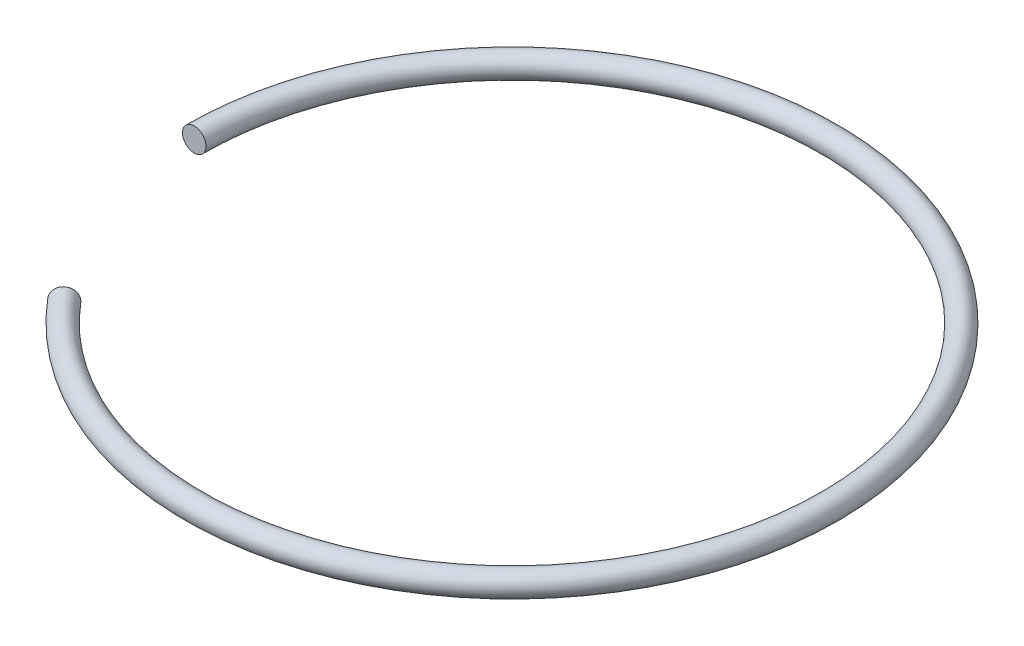
ISO-10303-21;
HEADER;
FILE_DESCRIPTION(('STEP AP214'),'2;1');
FILE_NAME('part.step','',(''),(''),'','','');
FILE_SCHEMA(('AUTOMOTIVE_DESIGN { 1 0 10303 214 1 1 1 1 }'));
ENDSEC;
DATA;
#1=APPLICATION_CONTEXT('core data for automotive mechanical design processes');
#2=APPLICATION_PROTOCOL_DEFINITION('international standard','automotive_design',2000,#1);
#3=PRODUCT_CONTEXT('',#1,'mechanical');
#4=PRODUCT('Part','Part','',(#3));
#5=PRODUCT_RELATED_PRODUCT_CATEGORY('part','',(#4));
#6=PRODUCT_DEFINITION_FORMATION('','',#4);
#7=PRODUCT_DEFINITION_CONTEXT('part definition',#1,'design');
#8=PRODUCT_DEFINITION('design','',#6,#7);
#9=PRODUCT_DEFINITION_SHAPE('','',#8);
#10=(LENGTH_UNIT() NAMED_UNIT(*) SI_UNIT(.MILLI.,.METRE.));
#11=(NAMED_UNIT(*) PLANE_ANGLE_UNIT() SI_UNIT($,.RADIAN.));
#12=(NAMED_UNIT(*) SI_UNIT($,.STERADIAN.) SOLID_ANGLE_UNIT());
#13=UNCERTAINTY_MEASURE_WITH_UNIT(LENGTH_MEASURE(1.E-05),#10,'distance_accuracy_value','');
#14=(GEOMETRIC_REPRESENTATION_CONTEXT(3) GLOBAL_UNCERTAINTY_ASSIGNED_CONTEXT((#13)) GLOBAL_UNIT_ASSIGNED_CONTEXT((#10,
#11,#12)) REPRESENTATION_CONTEXT('',''));
#15=CARTESIAN_POINT('',(0.,0.,0.));
#16=DIRECTION('',(0.,0.,1.));
#17=DIRECTION('',(1.,0.,0.));
#18=AXIS2_PLACEMENT_3D('',#15,#16,#17);
#19=CARTESIAN_POINT('',(0.,0.,0.));
#20=DIRECTION('',(0.64278760968653,0.,0.766044443118986));
#21=DIRECTION('',(0.766044443118986,0.,-0.64278760968653));
#22=AXIS2_PLACEMENT_3D('',#19,#20,#21);
#23=PLANE('',#22);
#24=CARTESIAN_POINT('',(-2.52947875117889,1.4097,2.12248468718492));
#25=CARTESIAN_POINT('',(-2.52948564552293,1.42393035707391,2.12249047222646));
#26=CARTESIAN_POINT('',(-2.53134368048714,1.43824828029162,2.12404954867964));
#27=CARTESIAN_POINT('',(-2.53858226576155,1.46522713981076,2.13012344291365));
#28=CARTESIAN_POINT('',(-2.54396281607176,1.47788807611218,2.13463826069448));
#29=CARTESIAN_POINT('',(-2.55763185300517,1.5001838982527,2.14610794454385));
#30=CARTESIAN_POINT('',(-2.56592033962844,1.50981878409172,2.15306281061246));
#31=CARTESIAN_POINT('',(-2.58447292294758,1.52496068307499,2.16863027643293));
#32=CARTESIAN_POINT('',(-2.59473701964345,1.53046769621925,2.1772428761848));
#33=CARTESIAN_POINT('',(-2.61608303585986,1.53673686264336,2.19515431051909));
#34=CARTESIAN_POINT('',(-2.6271649553804,1.53749901592321,2.20445314510152));
#35=CARTESIAN_POINT('',(-2.64889742995875,1.53419255040931,2.22268885650478));
#36=CARTESIAN_POINT('',(-2.65954798501655,1.53012393161555,2.23162573332561));
#37=CARTESIAN_POINT('',(-2.67921668929064,1.51761068190603,2.24812973582774));
#38=CARTESIAN_POINT('',(-2.68823483850693,1.50916605099026,2.25569686150903));
#39=CARTESIAN_POINT('',(-2.70362287646383,1.48886861413728,2.2686089584832));
#40=CARTESIAN_POINT('',(-2.70999276520443,1.47701580820007,2.27395392977608));
#41=CARTESIAN_POINT('',(-2.71936290454166,1.4511792051199,2.28181641023803));
#42=CARTESIAN_POINT('',(-2.72236315513829,1.43719540797694,2.2843339194071));
#43=CARTESIAN_POINT('',(-2.72387657039702,1.41861030553464,2.28560382559252));
#44=CARTESIAN_POINT('',(-2.72405620025311,1.41415945246293,2.28575455293851));
#45=CARTESIAN_POINT('',(-2.72404714538708,1.39546964292609,2.28574695500377));
#46=CARTESIAN_POINT('',(-2.72218911042287,1.38115171970838,2.28418787855058));
#47=CARTESIAN_POINT('',(-2.71495052514845,1.35417286018924,2.27811398431657));
#48=CARTESIAN_POINT('',(-2.70956997483824,1.34151192388782,2.27359916653575));
#49=CARTESIAN_POINT('',(-2.69590093790483,1.3192161017473,2.26212948268638));
#50=CARTESIAN_POINT('',(-2.68761245128156,1.30958121590828,2.25517461661777));
#51=CARTESIAN_POINT('',(-2.66905986796242,1.294439316925,2.23960715079729));
#52=CARTESIAN_POINT('',(-2.65879577126655,1.28893230378075,2.23099455104543));
#53=CARTESIAN_POINT('',(-2.63744975505015,1.28266313735664,2.21308311671113));
#54=CARTESIAN_POINT('',(-2.6263678355296,1.28190098407679,2.20378428212871));
#55=CARTESIAN_POINT('',(-2.60463536095126,1.28520744959069,2.18554857072545));
#56=CARTESIAN_POINT('',(-2.59398480589345,1.28927606838444,2.17661169390462));
#57=CARTESIAN_POINT('',(-2.57431610161936,1.30178931809397,2.16010769140249));
#58=CARTESIAN_POINT('',(-2.56529795240307,1.31023394900974,2.1525405657212));
#59=CARTESIAN_POINT('',(-2.54990991444617,1.33053138586272,2.13962846874702));
#60=CARTESIAN_POINT('',(-2.54354002570557,1.34238419179993,2.13428349745414));
#61=CARTESIAN_POINT('',(-2.53416988636834,1.3682207948801,2.1264210169922));
#62=CARTESIAN_POINT('',(-2.53116963577172,1.38220459202306,2.12390350782313));
#63=CARTESIAN_POINT('',(-2.52965622051299,1.40078969446536,2.12263360163771));
#64=CARTESIAN_POINT('',(-2.52947659065689,1.40524054753707,2.12248287429171));
#65=CARTESIAN_POINT('',(-2.52947875117889,1.4097,2.12248468718492));
#66=B_SPLINE_CURVE_WITH_KNOTS('',3,(#24,#25,#26,#27,#28,#29,#30,#31,#32,#33,#34,#35,#36,#37,#38,
#39,#40,#41,#42,#43,#44,#45,#46,#47,#48,#49,#50,#51,#52,#53,#54,#55,#56,#57,#58,#59,#60,#61,#62,
#63,#64,#65),.UNSPECIFIED.,.T.,.F.,(4,2,2,2,2,2,2,2,2,2,2,2,2,2,2,2,2,2,2,2,4),(0.,
0.0426429642402329,0.0852859284804661,0.127928892721775,0.170571856963085,0.213214821204394,
0.255857785445703,0.298500749687012,0.341143713928321,0.38378667816963,0.39714995998469,
0.439792924224923,0.482435888465157,0.525078852706466,0.567721816947775,0.610364781189084,
0.653007745430393,0.695650709671702,0.738293673913012,0.780936638154321,0.794299919969381),.UNSPECIFIED.);
#67=CARTESIAN_POINT('',(-2.52947875117889,1.4097,2.12248468718492));
#68=VERTEX_POINT('',#67);
#69=EDGE_CURVE('E19',#68,#68,#66,.T.);
#70=ORIENTED_EDGE('',*,*,#69,.F.);
#71=EDGE_LOOP('',(#70));
#72=FACE_BOUND('',#71,.T.);
#73=ADVANCED_FACE('F15',(#72),#23,.F.);
#74=CARTESIAN_POINT('',(0.,0.,0.));
#75=DIRECTION('',(0.,0.,1.));
#76=DIRECTION('',(1.,0.,0.));
#77=AXIS2_PLACEMENT_3D('',#74,#75,#76);
#78=PLANE('',#77);
#79=CARTESIAN_POINT('',(-3.556,1.4097,0.));
#80=CARTESIAN_POINT('',(-3.55599100007304,1.42393035707391,0.));
#81=CARTESIAN_POINT('',(-3.55356550768693,1.43824828029162,0.));
#82=CARTESIAN_POINT('',(-3.54411620570525,1.46522713981076,0.));
#83=CARTESIAN_POINT('',(-3.53709239610969,1.47788807611218,0.));
#84=CARTESIAN_POINT('',(-3.51924873565866,1.5001838982527,0.));
#85=CARTESIAN_POINT('',(-3.50842888480311,1.50981878409172,0.));
#86=CARTESIAN_POINT('',(-3.48421020730236,1.52496068307499,0.));
#87=CARTESIAN_POINT('',(-3.47081138065716,1.53046769621925,0.));
#88=CARTESIAN_POINT('',(-3.44294613549006,1.53673686264336,0.));
#89=CARTESIAN_POINT('',(-3.42847971696815,1.53749901592321,0.));
#90=CARTESIAN_POINT('',(-3.40010998623835,1.53419255040931,0.));
#91=CARTESIAN_POINT('',(-3.38620667403046,1.53012393161555,0.));
#92=CARTESIAN_POINT('',(-3.36053100409934,1.51761068190603,0.));
#93=CARTESIAN_POINT('',(-3.3487586463761,1.50916605099026,0.));
#94=CARTESIAN_POINT('',(-3.32867098945865,1.48886861413728,0.));
#95=CARTESIAN_POINT('',(-3.32035569026443,1.47701580820007,0.));
#96=CARTESIAN_POINT('',(-3.30812384207155,1.4511792051199,0.));
#97=CARTESIAN_POINT('',(-3.30420729307289,1.43719540797693,0.));
#98=CARTESIAN_POINT('',(-3.30223166976236,1.41861030553464,0.));
#99=CARTESIAN_POINT('',(-3.30199717963883,1.41415945246293,0.));
#100=CARTESIAN_POINT('',(-3.30200899992696,1.39546964292609,0.));
#101=CARTESIAN_POINT('',(-3.30443449231307,1.38115171970838,0.));
#102=CARTESIAN_POINT('',(-3.31388379429475,1.35417286018924,0.));
#103=CARTESIAN_POINT('',(-3.32090760389031,1.34151192388782,0.));
#104=CARTESIAN_POINT('',(-3.33875126434134,1.3192161017473,0.));
#105=CARTESIAN_POINT('',(-3.3495711151969,1.30958121590828,0.));
#106=CARTESIAN_POINT('',(-3.37378979269764,1.294439316925,0.));
#107=CARTESIAN_POINT('',(-3.38718861934284,1.28893230378075,0.));
#108=CARTESIAN_POINT('',(-3.41505386450994,1.28266313735664,0.));
#109=CARTESIAN_POINT('',(-3.42952028303185,1.28190098407679,0.));
#110=CARTESIAN_POINT('',(-3.45789001376165,1.28520744959069,0.));
#111=CARTESIAN_POINT('',(-3.47179332596954,1.28927606838444,0.));
#112=CARTESIAN_POINT('',(-3.49746899590067,1.30178931809397,0.));
#113=CARTESIAN_POINT('',(-3.5092413536239,1.31023394900974,0.));
#114=CARTESIAN_POINT('',(-3.52932901054135,1.33053138586272,0.));
#115=CARTESIAN_POINT('',(-3.53764430973557,1.34238419179993,0.));
#116=CARTESIAN_POINT('',(-3.54987615792845,1.3682207948801,0.));
#117=CARTESIAN_POINT('',(-3.55379270692711,1.38220459202306,0.));
#118=CARTESIAN_POINT('',(-3.55576833023764,1.40078969446536,0.));
#119=CARTESIAN_POINT('',(-3.55600282036117,1.40524054753707,0.));
#120=CARTESIAN_POINT('',(-3.556,1.4097,0.));
#121=B_SPLINE_CURVE_WITH_KNOTS('',3,(#79,#80,#81,#82,#83,#84,#85,#86,#87,#88,#89,#90,#91,#92,
#93,#94,#95,#96,#97,#98,#99,#100,#101,#102,#103,#104,#105,#106,#107,#108,#109,#110,#111,#112,
#113,#114,#115,#116,#117,#118,#119,#120),.UNSPECIFIED.,.T.,.F.,(4,2,2,2,2,2,2,2,2,2,2,2,2,2,2,2,
2,2,2,2,4),(0.,0.0426429642402328,0.085285928480466,0.127928892721775,0.170571856963084,
0.213214821204394,0.255857785445703,0.298500749687012,0.341143713928321,0.38378667816963,
0.39714995998469,0.439792924224923,0.482435888465157,0.525078852706466,0.567721816947775,
0.610364781189084,0.653007745430393,0.695650709671702,0.738293673913012,0.780936638154321,
0.794299919969381),.UNSPECIFIED.);
#122=CARTESIAN_POINT('',(-3.556,1.4097,0.));
#123=VERTEX_POINT('',#122);
#124=EDGE_CURVE('E10',#123,#123,#121,.T.);
#125=ORIENTED_EDGE('',*,*,#124,.F.);
#126=EDGE_LOOP('',(#125));
#127=FACE_BOUND('',#126,.T.);
#128=ADVANCED_FACE('F37',(#127),#78,.T.);
#129=CARTESIAN_POINT('',(0.,1.4097,0.));
#130=DIRECTION('',(0.,1.,0.));
#131=DIRECTION('',(0.,0.,1.));
#132=AXIS2_PLACEMENT_3D('',#129,#130,#131);
#133=TOROIDAL_SURFACE('',#132,3.429,0.127000000000001);
#134=ORIENTED_EDGE('',*,*,#124,.T.);
#135=EDGE_LOOP('',(#134));
#136=FACE_BOUND('',#135,.T.);
#137=ORIENTED_EDGE('',*,*,#69,.T.);
#138=EDGE_LOOP('',(#137));
#139=FACE_BOUND('',#138,.T.);
#140=ADVANCED_FACE('F35',(#136,#139),#133,.T.);
#141=CLOSED_SHELL('',(#73,#128,#140));
#142=MANIFOLD_SOLID_BREP('B1',#141);
#143=ADVANCED_BREP_SHAPE_REPRESENTATION('',(#18,#142),#14);
#144=SHAPE_DEFINITION_REPRESENTATION(#9,#143);
ENDSEC;
END-ISO-10303-21;
